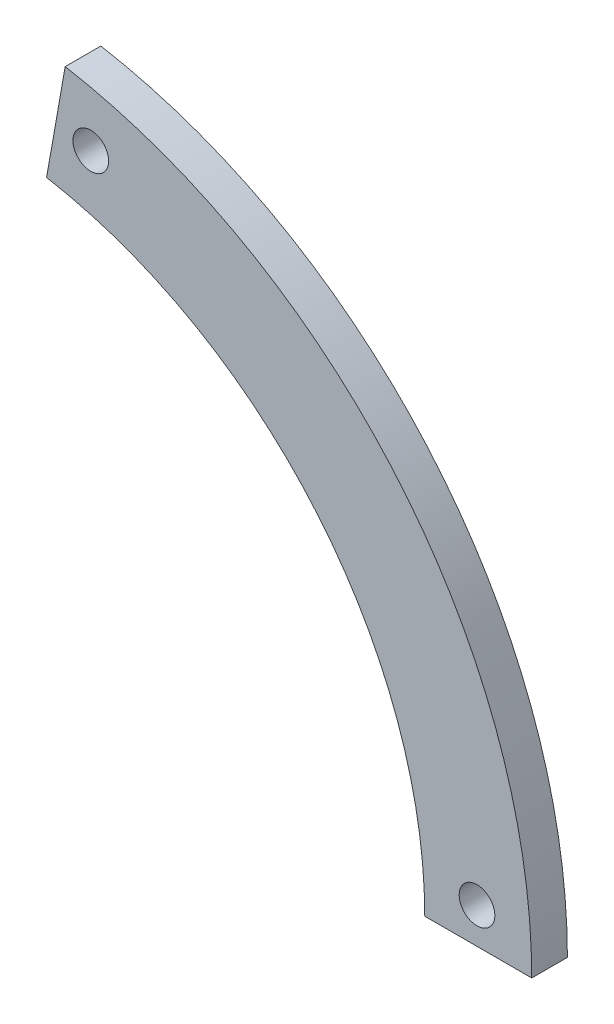
ISO-10303-21;
HEADER;
FILE_DESCRIPTION(('STEP AP214'),'2;1');
FILE_NAME('part.step','',(''),(''),'','','');
FILE_SCHEMA(('AUTOMOTIVE_DESIGN { 1 0 10303 214 1 1 1 1 }'));
ENDSEC;
DATA;
#1=APPLICATION_CONTEXT('core data for automotive mechanical design processes');
#2=APPLICATION_PROTOCOL_DEFINITION('international standard','automotive_design',2000,#1);
#3=PRODUCT_CONTEXT('',#1,'mechanical');
#4=PRODUCT('Part','Part','',(#3));
#5=PRODUCT_RELATED_PRODUCT_CATEGORY('part','',(#4));
#6=PRODUCT_DEFINITION_FORMATION('','',#4);
#7=PRODUCT_DEFINITION_CONTEXT('part definition',#1,'design');
#8=PRODUCT_DEFINITION('design','',#6,#7);
#9=PRODUCT_DEFINITION_SHAPE('','',#8);
#10=(LENGTH_UNIT() NAMED_UNIT(*) SI_UNIT(.MILLI.,.METRE.));
#11=(NAMED_UNIT(*) PLANE_ANGLE_UNIT() SI_UNIT($,.RADIAN.));
#12=(NAMED_UNIT(*) SI_UNIT($,.STERADIAN.) SOLID_ANGLE_UNIT());
#13=UNCERTAINTY_MEASURE_WITH_UNIT(LENGTH_MEASURE(1.E-05),#10,'distance_accuracy_value','');
#14=(GEOMETRIC_REPRESENTATION_CONTEXT(3) GLOBAL_UNCERTAINTY_ASSIGNED_CONTEXT((#13)) GLOBAL_UNIT_ASSIGNED_CONTEXT((#10,
#11,#12)) REPRESENTATION_CONTEXT('',''));
#15=CARTESIAN_POINT('',(0.,0.,0.));
#16=DIRECTION('',(0.,0.,1.));
#17=DIRECTION('',(1.,0.,0.));
#18=AXIS2_PLACEMENT_3D('',#15,#16,#17);
#19=CARTESIAN_POINT('',(0.,0.,3.));
#20=DIRECTION('',(0.,0.,-1.));
#21=DIRECTION('',(-1.,0.,0.));
#22=AXIS2_PLACEMENT_3D('',#19,#20,#21);
#23=PLANE('',#22);
#24=CARTESIAN_POINT('',(0.,0.,3.));
#25=DIRECTION('',(0.,0.,-1.));
#26=DIRECTION('',(-1.,0.,0.));
#27=AXIS2_PLACEMENT_3D('',#24,#25,#26);
#28=CIRCLE('',#27,38.5);
#29=CARTESIAN_POINT('',(6.6854548401767,37.91509849097,3.));
#30=VERTEX_POINT('',#29);
#31=CARTESIAN_POINT('',(38.5,0.,3.));
#32=VERTEX_POINT('',#31);
#33=EDGE_CURVE('E91',#30,#32,#28,.T.);
#34=ORIENTED_EDGE('',*,*,#33,.T.);
#35=DIRECTION('',(1.,0.,0.));
#36=VECTOR('',#35,1.);
#37=CARTESIAN_POINT('',(47.5,0.,3.));
#38=LINE('',#37,#36);
#39=CARTESIAN_POINT('',(47.5,0.,3.));
#40=VERTEX_POINT('',#39);
#41=EDGE_CURVE('E86',#32,#40,#38,.T.);
#42=ORIENTED_EDGE('',*,*,#41,.T.);
#43=CARTESIAN_POINT('',(0.,0.,3.));
#44=DIRECTION('',(0.,0.,1.));
#45=DIRECTION('',(-1.,0.,0.));
#46=AXIS2_PLACEMENT_3D('',#43,#44,#45);
#47=CIRCLE('',#46,47.5);
#48=CARTESIAN_POINT('',(8.24828843917904,46.7783682680799,3.));
#49=VERTEX_POINT('',#48);
#50=EDGE_CURVE('E89',#40,#49,#47,.T.);
#51=ORIENTED_EDGE('',*,*,#50,.T.);
#52=DIRECTION('',(-0.173648177666927,-0.984807753012209,0.));
#53=VECTOR('',#52,1.);
#54=CARTESIAN_POINT('',(8.24828843917904,46.7783682680799,3.));
#55=LINE('',#54,#53);
#56=EDGE_CURVE('E56',#49,#30,#55,.T.);
#57=ORIENTED_EDGE('',*,*,#56,.T.);
#58=EDGE_LOOP('',(#34,#42,#51,#57));
#59=FACE_BOUND('',#58,.T.);
#60=CARTESIAN_POINT('',(42.8952211790544,3.,3.));
#61=DIRECTION('',(0.,0.,1.));
#62=DIRECTION('',(1.,0.,0.));
#63=AXIS2_PLACEMENT_3D('',#60,#61,#62);
#64=CIRCLE('',#63,1.5);
#65=CARTESIAN_POINT('',(44.3952211790544,3.,3.));
#66=VERTEX_POINT('',#65);
#67=EDGE_CURVE('E106',#66,#66,#64,.T.);
#68=ORIENTED_EDGE('',*,*,#67,.F.);
#69=EDGE_LOOP('',(#68));
#70=FACE_BOUND('',#69,.T.);
#71=CARTESIAN_POINT('',(10.4031002473992,41.7226018513055,3.));
#72=DIRECTION('',(0.,0.,1.));
#73=DIRECTION('',(1.,0.,0.));
#74=AXIS2_PLACEMENT_3D('',#71,#72,#73);
#75=CIRCLE('',#74,1.5);
#76=CARTESIAN_POINT('',(11.9031002473992,41.7226018513055,3.));
#77=VERTEX_POINT('',#76);
#78=EDGE_CURVE('E121',#77,#77,#75,.T.);
#79=ORIENTED_EDGE('',*,*,#78,.F.);
#80=EDGE_LOOP('',(#79));
#81=FACE_BOUND('',#80,.T.);
#82=ADVANCED_FACE('F39',(#59,#70,#81),#23,.F.);
#83=CARTESIAN_POINT('',(0.,0.,0.));
#84=DIRECTION('',(0.,0.,-1.));
#85=DIRECTION('',(-1.,0.,0.));
#86=AXIS2_PLACEMENT_3D('',#83,#84,#85);
#87=PLANE('',#86);
#88=CARTESIAN_POINT('',(42.8952211790544,3.,0.));
#89=DIRECTION('',(0.,0.,1.));
#90=DIRECTION('',(1.,0.,0.));
#91=AXIS2_PLACEMENT_3D('',#88,#89,#90);
#92=CIRCLE('',#91,1.5);
#93=CARTESIAN_POINT('',(44.3952211790544,3.,0.));
#94=VERTEX_POINT('',#93);
#95=EDGE_CURVE('E118',#94,#94,#92,.T.);
#96=ORIENTED_EDGE('',*,*,#95,.T.);
#97=EDGE_LOOP('',(#96));
#98=FACE_BOUND('',#97,.T.);
#99=CARTESIAN_POINT('',(0.,0.,0.));
#100=DIRECTION('',(0.,0.,-1.));
#101=DIRECTION('',(-1.,0.,0.));
#102=AXIS2_PLACEMENT_3D('',#99,#100,#101);
#103=CIRCLE('',#102,38.5);
#104=CARTESIAN_POINT('',(6.6854548401767,37.91509849097,0.));
#105=VERTEX_POINT('',#104);
#106=CARTESIAN_POINT('',(38.5,0.,0.));
#107=VERTEX_POINT('',#106);
#108=EDGE_CURVE('E103',#105,#107,#103,.T.);
#109=ORIENTED_EDGE('',*,*,#108,.F.);
#110=DIRECTION('',(-0.173648177666927,-0.984807753012209,0.));
#111=VECTOR('',#110,1.);
#112=CARTESIAN_POINT('',(8.24828843917904,46.7783682680799,0.));
#113=LINE('',#112,#111);
#114=CARTESIAN_POINT('',(8.24828843917904,46.7783682680799,0.));
#115=VERTEX_POINT('',#114);
#116=EDGE_CURVE('E79',#115,#105,#113,.T.);
#117=ORIENTED_EDGE('',*,*,#116,.F.);
#118=CARTESIAN_POINT('',(0.,0.,0.));
#119=DIRECTION('',(0.,0.,1.));
#120=DIRECTION('',(-1.,0.,0.));
#121=AXIS2_PLACEMENT_3D('',#118,#119,#120);
#122=CIRCLE('',#121,47.5);
#123=CARTESIAN_POINT('',(47.5,0.,0.));
#124=VERTEX_POINT('',#123);
#125=EDGE_CURVE('E73',#124,#115,#122,.T.);
#126=ORIENTED_EDGE('',*,*,#125,.F.);
#127=DIRECTION('',(1.,0.,0.));
#128=VECTOR('',#127,1.);
#129=CARTESIAN_POINT('',(47.5,0.,0.));
#130=LINE('',#129,#128);
#131=EDGE_CURVE('E95',#107,#124,#130,.T.);
#132=ORIENTED_EDGE('',*,*,#131,.F.);
#133=EDGE_LOOP('',(#109,#117,#126,#132));
#134=FACE_BOUND('',#133,.T.);
#135=CARTESIAN_POINT('',(10.4031002473992,41.7226018513055,0.));
#136=DIRECTION('',(0.,0.,1.));
#137=DIRECTION('',(1.,0.,0.));
#138=AXIS2_PLACEMENT_3D('',#135,#136,#137);
#139=CIRCLE('',#138,1.5);
#140=CARTESIAN_POINT('',(11.9031002473992,41.7226018513055,0.));
#141=VERTEX_POINT('',#140);
#142=EDGE_CURVE('E124',#141,#141,#139,.T.);
#143=ORIENTED_EDGE('',*,*,#142,.T.);
#144=EDGE_LOOP('',(#143));
#145=FACE_BOUND('',#144,.T.);
#146=ADVANCED_FACE('F114',(#98,#134,#145),#87,.T.);
#147=CARTESIAN_POINT('',(0.,0.,3.));
#148=DIRECTION('',(0.,0.,-1.));
#149=DIRECTION('',(-1.,0.,0.));
#150=AXIS2_PLACEMENT_3D('',#147,#148,#149);
#151=CYLINDRICAL_SURFACE('',#150,38.5);
#152=ORIENTED_EDGE('',*,*,#108,.T.);
#153=DIRECTION('',(0.,0.,-1.));
#154=VECTOR('',#153,1.);
#155=CARTESIAN_POINT('',(38.5,0.,3.));
#156=LINE('',#155,#154);
#157=EDGE_CURVE('E11',#32,#107,#156,.T.);
#158=ORIENTED_EDGE('',*,*,#157,.F.);
#159=ORIENTED_EDGE('',*,*,#33,.F.);
#160=DIRECTION('',(0.,0.,-1.));
#161=VECTOR('',#160,1.);
#162=CARTESIAN_POINT('',(6.6854548401767,37.91509849097,3.));
#163=LINE('',#162,#161);
#164=EDGE_CURVE('E99',#30,#105,#163,.T.);
#165=ORIENTED_EDGE('',*,*,#164,.T.);
#166=EDGE_LOOP('',(#152,#158,#159,#165));
#167=FACE_BOUND('',#166,.T.);
#168=ADVANCED_FACE('F41',(#167),#151,.F.);
#169=CARTESIAN_POINT('',(47.5,0.,3.));
#170=DIRECTION('',(0.,1.,0.));
#171=DIRECTION('',(-1.,0.,0.));
#172=AXIS2_PLACEMENT_3D('',#169,#170,#171);
#173=PLANE('',#172);
#174=ORIENTED_EDGE('',*,*,#131,.T.);
#175=DIRECTION('',(0.,0.,-1.));
#176=VECTOR('',#175,1.);
#177=CARTESIAN_POINT('',(47.5,0.,3.));
#178=LINE('',#177,#176);
#179=EDGE_CURVE('E48',#40,#124,#178,.T.);
#180=ORIENTED_EDGE('',*,*,#179,.F.);
#181=ORIENTED_EDGE('',*,*,#41,.F.);
#182=ORIENTED_EDGE('',*,*,#157,.T.);
#183=EDGE_LOOP('',(#174,#180,#181,#182));
#184=FACE_BOUND('',#183,.T.);
#185=ADVANCED_FACE('F94',(#184),#173,.F.);
#186=CARTESIAN_POINT('',(0.,0.,3.));
#187=DIRECTION('',(0.,0.,-1.));
#188=DIRECTION('',(-1.,0.,0.));
#189=AXIS2_PLACEMENT_3D('',#186,#187,#188);
#190=CYLINDRICAL_SURFACE('',#189,47.5);
#191=ORIENTED_EDGE('',*,*,#125,.T.);
#192=DIRECTION('',(0.,0.,-1.));
#193=VECTOR('',#192,1.);
#194=CARTESIAN_POINT('',(8.24828843917904,46.7783682680799,3.));
#195=LINE('',#194,#193);
#196=EDGE_CURVE('E96',#49,#115,#195,.T.);
#197=ORIENTED_EDGE('',*,*,#196,.F.);
#198=ORIENTED_EDGE('',*,*,#50,.F.);
#199=ORIENTED_EDGE('',*,*,#179,.T.);
#200=EDGE_LOOP('',(#191,#197,#198,#199));
#201=FACE_BOUND('',#200,.T.);
#202=ADVANCED_FACE('F97',(#201),#190,.T.);
#203=CARTESIAN_POINT('',(8.24828843917904,46.7783682680799,3.));
#204=DIRECTION('',(0.984807753012209,-0.173648177666927,0.));
#205=DIRECTION('',(0.173648177666927,0.984807753012209,0.));
#206=AXIS2_PLACEMENT_3D('',#203,#204,#205);
#207=PLANE('',#206);
#208=ORIENTED_EDGE('',*,*,#116,.T.);
#209=ORIENTED_EDGE('',*,*,#164,.F.);
#210=ORIENTED_EDGE('',*,*,#56,.F.);
#211=ORIENTED_EDGE('',*,*,#196,.T.);
#212=EDGE_LOOP('',(#208,#209,#210,#211));
#213=FACE_BOUND('',#212,.T.);
#214=ADVANCED_FACE('F111',(#213),#207,.F.);
#215=CARTESIAN_POINT('',(42.8952211790544,3.,3.));
#216=DIRECTION('',(0.,0.,-1.));
#217=DIRECTION('',(-1.,0.,0.));
#218=AXIS2_PLACEMENT_3D('',#215,#216,#217);
#219=CYLINDRICAL_SURFACE('',#218,1.5);
#220=ORIENTED_EDGE('',*,*,#67,.T.);
#221=EDGE_LOOP('',(#220));
#222=FACE_BOUND('',#221,.T.);
#223=ORIENTED_EDGE('',*,*,#95,.F.);
#224=EDGE_LOOP('',(#223));
#225=FACE_BOUND('',#224,.T.);
#226=ADVANCED_FACE('F141',(#222,#225),#219,.F.);
#227=CARTESIAN_POINT('',(10.4031002473992,41.7226018513055,3.));
#228=DIRECTION('',(0.,0.,-1.));
#229=DIRECTION('',(-1.,0.,0.));
#230=AXIS2_PLACEMENT_3D('',#227,#228,#229);
#231=CYLINDRICAL_SURFACE('',#230,1.5);
#232=ORIENTED_EDGE('',*,*,#78,.T.);
#233=EDGE_LOOP('',(#232));
#234=FACE_BOUND('',#233,.T.);
#235=ORIENTED_EDGE('',*,*,#142,.F.);
#236=EDGE_LOOP('',(#235));
#237=FACE_BOUND('',#236,.T.);
#238=ADVANCED_FACE('F130',(#234,#237),#231,.F.);
#239=CLOSED_SHELL('',(#82,#146,#168,#185,#202,#214,#226,#238));
#240=MANIFOLD_SOLID_BREP('B2',#239);
#241=ADVANCED_BREP_SHAPE_REPRESENTATION('',(#18,#240),#14);
#242=SHAPE_DEFINITION_REPRESENTATION(#9,#241);
ENDSEC;
END-ISO-10303-21;
